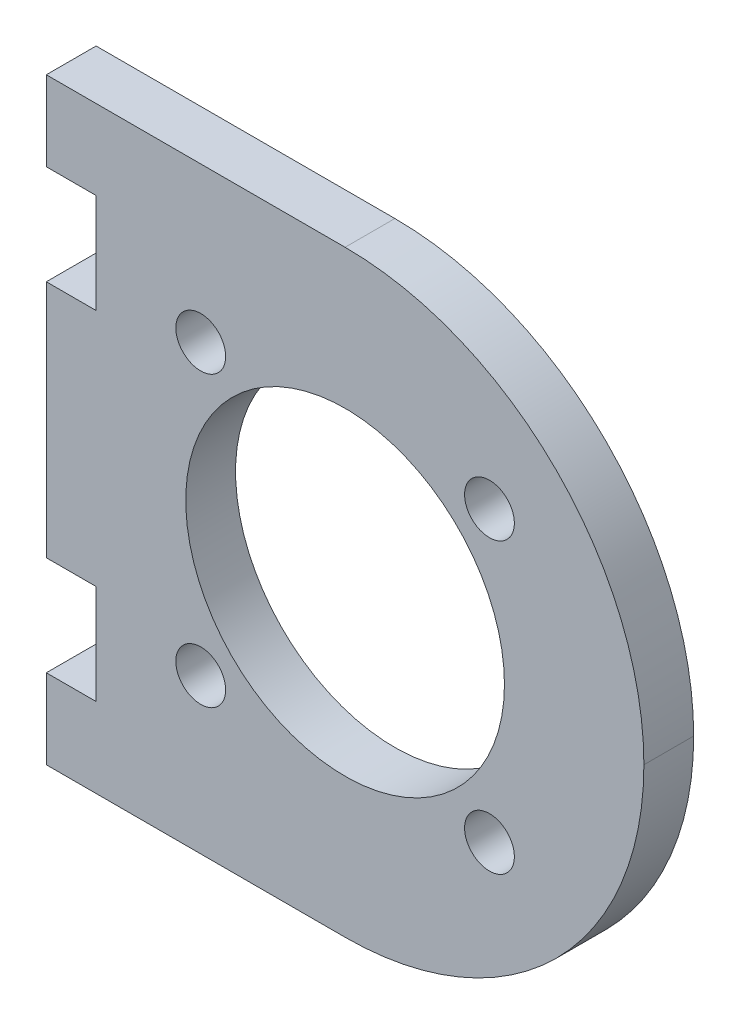
ISO-10303-21;
HEADER;
FILE_DESCRIPTION(('STEP AP214'),'2;1');
FILE_NAME('part.step','',(''),(''),'','','');
FILE_SCHEMA(('AUTOMOTIVE_DESIGN { 1 0 10303 214 1 1 1 1 }'));
ENDSEC;
DATA;
#1=APPLICATION_CONTEXT('core data for automotive mechanical design processes');
#2=APPLICATION_PROTOCOL_DEFINITION('international standard','automotive_design',2000,#1);
#3=PRODUCT_CONTEXT('',#1,'mechanical');
#4=PRODUCT('Part','Part','',(#3));
#5=PRODUCT_RELATED_PRODUCT_CATEGORY('part','',(#4));
#6=PRODUCT_DEFINITION_FORMATION('','',#4);
#7=PRODUCT_DEFINITION_CONTEXT('part definition',#1,'design');
#8=PRODUCT_DEFINITION('design','',#6,#7);
#9=PRODUCT_DEFINITION_SHAPE('','',#8);
#10=(LENGTH_UNIT() NAMED_UNIT(*) SI_UNIT(.MILLI.,.METRE.));
#11=(NAMED_UNIT(*) PLANE_ANGLE_UNIT() SI_UNIT($,.RADIAN.));
#12=(NAMED_UNIT(*) SI_UNIT($,.STERADIAN.) SOLID_ANGLE_UNIT());
#13=UNCERTAINTY_MEASURE_WITH_UNIT(LENGTH_MEASURE(1.E-05),#10,'distance_accuracy_value','');
#14=(GEOMETRIC_REPRESENTATION_CONTEXT(3) GLOBAL_UNCERTAINTY_ASSIGNED_CONTEXT((#13)) GLOBAL_UNIT_ASSIGNED_CONTEXT((#10,
#11,#12)) REPRESENTATION_CONTEXT('',''));
#15=CARTESIAN_POINT('',(0.,0.,0.));
#16=DIRECTION('',(0.,0.,1.));
#17=DIRECTION('',(1.,0.,0.));
#18=AXIS2_PLACEMENT_3D('',#15,#16,#17);
#19=CARTESIAN_POINT('',(0.,0.,5.));
#20=DIRECTION('',(0.,0.,1.));
#21=DIRECTION('',(1.,0.,0.));
#22=AXIS2_PLACEMENT_3D('',#19,#20,#21);
#23=PLANE('',#22);
#24=CARTESIAN_POINT('',(14.4956890143243,-14.4956890143243,5.));
#25=DIRECTION('',(0.,0.,1.));
#26=DIRECTION('',(1.,0.,0.));
#27=AXIS2_PLACEMENT_3D('',#24,#25,#26);
#28=CIRCLE('',#27,2.50000000000016);
#29=CARTESIAN_POINT('',(16.9956890143245,-14.4956890143243,5.));
#30=VERTEX_POINT('',#29);
#31=EDGE_CURVE('E199',#30,#30,#28,.T.);
#32=ORIENTED_EDGE('',*,*,#31,.F.);
#33=EDGE_LOOP('',(#32));
#34=FACE_BOUND('',#33,.T.);
#35=CARTESIAN_POINT('',(-14.4956890143242,14.4956890143242,5.));
#36=DIRECTION('',(0.,0.,1.));
#37=DIRECTION('',(1.,0.,0.));
#38=AXIS2_PLACEMENT_3D('',#35,#36,#37);
#39=CIRCLE('',#38,2.5);
#40=CARTESIAN_POINT('',(-11.9956890143242,14.4956890143242,5.));
#41=VERTEX_POINT('',#40);
#42=EDGE_CURVE('E211',#41,#41,#39,.T.);
#43=ORIENTED_EDGE('',*,*,#42,.F.);
#44=EDGE_LOOP('',(#43));
#45=FACE_BOUND('',#44,.T.);
#46=CARTESIAN_POINT('',(0.,0.,5.));
#47=DIRECTION('',(0.,0.,1.));
#48=DIRECTION('',(1.,0.,0.));
#49=AXIS2_PLACEMENT_3D('',#46,#47,#48);
#50=CIRCLE('',#49,30.);
#51=CARTESIAN_POINT('',(0.,-30.,5.));
#52=VERTEX_POINT('',#51);
#53=CARTESIAN_POINT('',(30.,0.,5.));
#54=VERTEX_POINT('',#53);
#55=EDGE_CURVE('E55',#52,#54,#50,.T.);
#56=ORIENTED_EDGE('',*,*,#55,.T.);
#57=CARTESIAN_POINT('',(0.,0.,5.));
#58=DIRECTION('',(0.,0.,1.));
#59=DIRECTION('',(1.,0.,0.));
#60=AXIS2_PLACEMENT_3D('',#57,#58,#59);
#61=CIRCLE('',#60,30.);
#62=CARTESIAN_POINT('',(0.,30.,5.));
#63=VERTEX_POINT('',#62);
#64=EDGE_CURVE('E48',#54,#63,#61,.T.);
#65=ORIENTED_EDGE('',*,*,#64,.T.);
#66=DIRECTION('',(-1.,0.,0.));
#67=VECTOR('',#66,1.);
#68=CARTESIAN_POINT('',(30.,30.,5.));
#69=LINE('',#68,#67);
#70=CARTESIAN_POINT('',(-30.,30.,5.));
#71=VERTEX_POINT('',#70);
#72=EDGE_CURVE('E150',#63,#71,#69,.T.);
#73=ORIENTED_EDGE('',*,*,#72,.T.);
#74=DIRECTION('',(0.,-1.,0.));
#75=VECTOR('',#74,1.);
#76=CARTESIAN_POINT('',(-30.,22.,5.));
#77=LINE('',#76,#75);
#78=CARTESIAN_POINT('',(-30.,22.,5.));
#79=VERTEX_POINT('',#78);
#80=EDGE_CURVE('E145',#71,#79,#77,.T.);
#81=ORIENTED_EDGE('',*,*,#80,.T.);
#82=DIRECTION('',(1.,0.,0.));
#83=VECTOR('',#82,1.);
#84=CARTESIAN_POINT('',(-25.,22.,5.));
#85=LINE('',#84,#83);
#86=CARTESIAN_POINT('',(-25.,22.,5.));
#87=VERTEX_POINT('',#86);
#88=EDGE_CURVE('E135',#79,#87,#85,.T.);
#89=ORIENTED_EDGE('',*,*,#88,.T.);
#90=DIRECTION('',(0.,-1.,0.));
#91=VECTOR('',#90,1.);
#92=CARTESIAN_POINT('',(-25.,12.,5.));
#93=LINE('',#92,#91);
#94=CARTESIAN_POINT('',(-25.,12.,5.));
#95=VERTEX_POINT('',#94);
#96=EDGE_CURVE('E144',#87,#95,#93,.T.);
#97=ORIENTED_EDGE('',*,*,#96,.T.);
#98=DIRECTION('',(-1.,0.,0.));
#99=VECTOR('',#98,1.);
#100=CARTESIAN_POINT('',(-30.,12.,5.));
#101=LINE('',#100,#99);
#102=CARTESIAN_POINT('',(-30.,12.,5.));
#103=VERTEX_POINT('',#102);
#104=EDGE_CURVE('E223',#95,#103,#101,.T.);
#105=ORIENTED_EDGE('',*,*,#104,.T.);
#106=DIRECTION('',(0.,-1.,0.));
#107=VECTOR('',#106,1.);
#108=CARTESIAN_POINT('',(-30.,-12.,5.));
#109=LINE('',#108,#107);
#110=CARTESIAN_POINT('',(-30.,-12.,5.));
#111=VERTEX_POINT('',#110);
#112=EDGE_CURVE('E225',#103,#111,#109,.T.);
#113=ORIENTED_EDGE('',*,*,#112,.T.);
#114=DIRECTION('',(1.,0.,0.));
#115=VECTOR('',#114,1.);
#116=CARTESIAN_POINT('',(-30.,-12.,5.));
#117=LINE('',#116,#115);
#118=CARTESIAN_POINT('',(-25.,-12.,5.));
#119=VERTEX_POINT('',#118);
#120=EDGE_CURVE('E227',#111,#119,#117,.T.);
#121=ORIENTED_EDGE('',*,*,#120,.T.);
#122=DIRECTION('',(0.,-1.,0.));
#123=VECTOR('',#122,1.);
#124=CARTESIAN_POINT('',(-25.,-12.,5.));
#125=LINE('',#124,#123);
#126=CARTESIAN_POINT('',(-25.,-22.,5.));
#127=VERTEX_POINT('',#126);
#128=EDGE_CURVE('E229',#119,#127,#125,.T.);
#129=ORIENTED_EDGE('',*,*,#128,.T.);
#130=DIRECTION('',(-1.,0.,0.));
#131=VECTOR('',#130,1.);
#132=CARTESIAN_POINT('',(-25.,-22.,5.));
#133=LINE('',#132,#131);
#134=CARTESIAN_POINT('',(-30.,-22.,5.));
#135=VERTEX_POINT('',#134);
#136=EDGE_CURVE('E231',#127,#135,#133,.T.);
#137=ORIENTED_EDGE('',*,*,#136,.T.);
#138=DIRECTION('',(0.,-1.,0.));
#139=VECTOR('',#138,1.);
#140=CARTESIAN_POINT('',(-30.,-30.,5.));
#141=LINE('',#140,#139);
#142=CARTESIAN_POINT('',(-30.,-30.,5.));
#143=VERTEX_POINT('',#142);
#144=EDGE_CURVE('E233',#135,#143,#141,.T.);
#145=ORIENTED_EDGE('',*,*,#144,.T.);
#146=DIRECTION('',(1.,0.,0.));
#147=VECTOR('',#146,1.);
#148=CARTESIAN_POINT('',(30.,-30.,5.));
#149=LINE('',#148,#147);
#150=EDGE_CURVE('E180',#143,#52,#149,.T.);
#151=ORIENTED_EDGE('',*,*,#150,.T.);
#152=EDGE_LOOP('',(#56,#65,#73,#81,#89,#97,#105,#113,#121,#129,#137,#145,#151));
#153=FACE_BOUND('',#152,.T.);
#154=CARTESIAN_POINT('',(0.,0.,5.));
#155=DIRECTION('',(0.,0.,1.));
#156=DIRECTION('',(1.,0.,0.));
#157=AXIS2_PLACEMENT_3D('',#154,#155,#156);
#158=CIRCLE('',#157,16.);
#159=CARTESIAN_POINT('',(16.,0.,5.));
#160=VERTEX_POINT('',#159);
#161=EDGE_CURVE('E217',#160,#160,#158,.T.);
#162=ORIENTED_EDGE('',*,*,#161,.F.);
#163=EDGE_LOOP('',(#162));
#164=FACE_BOUND('',#163,.T.);
#165=CARTESIAN_POINT('',(14.4956890143244,14.4956890143242,5.));
#166=DIRECTION('',(0.,0.,1.));
#167=DIRECTION('',(1.,0.,0.));
#168=AXIS2_PLACEMENT_3D('',#165,#166,#167);
#169=CIRCLE('',#168,2.50000000000001);
#170=CARTESIAN_POINT('',(16.9956890143244,14.4956890143242,5.));
#171=VERTEX_POINT('',#170);
#172=EDGE_CURVE('E205',#171,#171,#169,.T.);
#173=ORIENTED_EDGE('',*,*,#172,.F.);
#174=EDGE_LOOP('',(#173));
#175=FACE_BOUND('',#174,.T.);
#176=CARTESIAN_POINT('',(-14.4956890143244,-14.495689014324,5.));
#177=DIRECTION('',(0.,0.,1.));
#178=DIRECTION('',(1.,0.,0.));
#179=AXIS2_PLACEMENT_3D('',#176,#177,#178);
#180=CIRCLE('',#179,2.5);
#181=CARTESIAN_POINT('',(-11.9956890143244,-14.495689014324,5.));
#182=VERTEX_POINT('',#181);
#183=EDGE_CURVE('E191',#182,#182,#180,.T.);
#184=ORIENTED_EDGE('',*,*,#183,.F.);
#185=EDGE_LOOP('',(#184));
#186=FACE_BOUND('',#185,.T.);
#187=ADVANCED_FACE('F39',(#34,#45,#153,#164,#175,#186),#23,.T.);
#188=CARTESIAN_POINT('',(0.,0.,0.));
#189=DIRECTION('',(0.,0.,1.));
#190=DIRECTION('',(1.,0.,0.));
#191=AXIS2_PLACEMENT_3D('',#188,#189,#190);
#192=PLANE('',#191);
#193=DIRECTION('',(-1.,0.,0.));
#194=VECTOR('',#193,1.);
#195=CARTESIAN_POINT('',(30.,30.,0.));
#196=LINE('',#195,#194);
#197=CARTESIAN_POINT('',(0.,30.,0.));
#198=VERTEX_POINT('',#197);
#199=CARTESIAN_POINT('',(-30.,30.,0.));
#200=VERTEX_POINT('',#199);
#201=EDGE_CURVE('E154',#198,#200,#196,.T.);
#202=ORIENTED_EDGE('',*,*,#201,.F.);
#203=CARTESIAN_POINT('',(0.,0.,0.));
#204=DIRECTION('',(0.,0.,1.));
#205=DIRECTION('',(1.,0.,0.));
#206=AXIS2_PLACEMENT_3D('',#203,#204,#205);
#207=CIRCLE('',#206,30.);
#208=CARTESIAN_POINT('',(30.,0.,0.));
#209=VERTEX_POINT('',#208);
#210=EDGE_CURVE('E169',#198,#209,#207,.F.);
#211=ORIENTED_EDGE('',*,*,#210,.T.);
#212=CARTESIAN_POINT('',(0.,0.,0.));
#213=DIRECTION('',(0.,0.,1.));
#214=DIRECTION('',(1.,0.,0.));
#215=AXIS2_PLACEMENT_3D('',#212,#213,#214);
#216=CIRCLE('',#215,30.);
#217=CARTESIAN_POINT('',(0.,-30.,0.));
#218=VERTEX_POINT('',#217);
#219=EDGE_CURVE('E162',#209,#218,#216,.F.);
#220=ORIENTED_EDGE('',*,*,#219,.T.);
#221=DIRECTION('',(1.,0.,0.));
#222=VECTOR('',#221,1.);
#223=CARTESIAN_POINT('',(30.,-30.,0.));
#224=LINE('',#223,#222);
#225=CARTESIAN_POINT('',(-30.,-30.,0.));
#226=VERTEX_POINT('',#225);
#227=EDGE_CURVE('E253',#226,#218,#224,.T.);
#228=ORIENTED_EDGE('',*,*,#227,.F.);
#229=DIRECTION('',(0.,-1.,0.));
#230=VECTOR('',#229,1.);
#231=CARTESIAN_POINT('',(-30.,-30.,0.));
#232=LINE('',#231,#230);
#233=CARTESIAN_POINT('',(-30.,-22.,0.));
#234=VERTEX_POINT('',#233);
#235=EDGE_CURVE('E251',#234,#226,#232,.T.);
#236=ORIENTED_EDGE('',*,*,#235,.F.);
#237=DIRECTION('',(-1.,0.,0.));
#238=VECTOR('',#237,1.);
#239=CARTESIAN_POINT('',(-25.,-22.,0.));
#240=LINE('',#239,#238);
#241=CARTESIAN_POINT('',(-25.,-22.,0.));
#242=VERTEX_POINT('',#241);
#243=EDGE_CURVE('E249',#242,#234,#240,.T.);
#244=ORIENTED_EDGE('',*,*,#243,.F.);
#245=DIRECTION('',(0.,-1.,0.));
#246=VECTOR('',#245,1.);
#247=CARTESIAN_POINT('',(-25.,-12.,0.));
#248=LINE('',#247,#246);
#249=CARTESIAN_POINT('',(-25.,-12.,0.));
#250=VERTEX_POINT('',#249);
#251=EDGE_CURVE('E247',#250,#242,#248,.T.);
#252=ORIENTED_EDGE('',*,*,#251,.F.);
#253=DIRECTION('',(1.,0.,0.));
#254=VECTOR('',#253,1.);
#255=CARTESIAN_POINT('',(-30.,-12.,0.));
#256=LINE('',#255,#254);
#257=CARTESIAN_POINT('',(-30.,-12.,0.));
#258=VERTEX_POINT('',#257);
#259=EDGE_CURVE('E245',#258,#250,#256,.T.);
#260=ORIENTED_EDGE('',*,*,#259,.F.);
#261=DIRECTION('',(0.,-1.,0.));
#262=VECTOR('',#261,1.);
#263=CARTESIAN_POINT('',(-30.,-12.,0.));
#264=LINE('',#263,#262);
#265=CARTESIAN_POINT('',(-30.,12.,0.));
#266=VERTEX_POINT('',#265);
#267=EDGE_CURVE('E243',#266,#258,#264,.T.);
#268=ORIENTED_EDGE('',*,*,#267,.F.);
#269=DIRECTION('',(-1.,0.,0.));
#270=VECTOR('',#269,1.);
#271=CARTESIAN_POINT('',(-30.,12.,0.));
#272=LINE('',#271,#270);
#273=CARTESIAN_POINT('',(-25.,12.,0.));
#274=VERTEX_POINT('',#273);
#275=EDGE_CURVE('E241',#274,#266,#272,.T.);
#276=ORIENTED_EDGE('',*,*,#275,.F.);
#277=DIRECTION('',(0.,-1.,0.));
#278=VECTOR('',#277,1.);
#279=CARTESIAN_POINT('',(-25.,12.,0.));
#280=LINE('',#279,#278);
#281=CARTESIAN_POINT('',(-25.,22.,0.));
#282=VERTEX_POINT('',#281);
#283=EDGE_CURVE('E239',#282,#274,#280,.T.);
#284=ORIENTED_EDGE('',*,*,#283,.F.);
#285=DIRECTION('',(1.,0.,0.));
#286=VECTOR('',#285,1.);
#287=CARTESIAN_POINT('',(-25.,22.,0.));
#288=LINE('',#287,#286);
#289=CARTESIAN_POINT('',(-30.,22.,0.));
#290=VERTEX_POINT('',#289);
#291=EDGE_CURVE('E237',#290,#282,#288,.T.);
#292=ORIENTED_EDGE('',*,*,#291,.F.);
#293=DIRECTION('',(0.,-1.,0.));
#294=VECTOR('',#293,1.);
#295=CARTESIAN_POINT('',(-30.,22.,0.));
#296=LINE('',#295,#294);
#297=EDGE_CURVE('E158',#200,#290,#296,.T.);
#298=ORIENTED_EDGE('',*,*,#297,.F.);
#299=EDGE_LOOP('',(#202,#211,#220,#228,#236,#244,#252,#260,#268,#276,#284,#292,#298));
#300=FACE_BOUND('',#299,.T.);
#301=CARTESIAN_POINT('',(0.,0.,0.));
#302=DIRECTION('',(0.,0.,1.));
#303=DIRECTION('',(1.,0.,0.));
#304=AXIS2_PLACEMENT_3D('',#301,#302,#303);
#305=CIRCLE('',#304,16.);
#306=CARTESIAN_POINT('',(16.,0.,0.));
#307=VERTEX_POINT('',#306);
#308=EDGE_CURVE('E214',#307,#307,#305,.T.);
#309=ORIENTED_EDGE('',*,*,#308,.T.);
#310=EDGE_LOOP('',(#309));
#311=FACE_BOUND('',#310,.T.);
#312=CARTESIAN_POINT('',(-14.4956890143242,14.4956890143242,0.));
#313=DIRECTION('',(0.,0.,1.));
#314=DIRECTION('',(1.,0.,0.));
#315=AXIS2_PLACEMENT_3D('',#312,#313,#314);
#316=CIRCLE('',#315,2.5);
#317=CARTESIAN_POINT('',(-11.9956890143242,14.4956890143242,0.));
#318=VERTEX_POINT('',#317);
#319=EDGE_CURVE('E208',#318,#318,#316,.T.);
#320=ORIENTED_EDGE('',*,*,#319,.T.);
#321=EDGE_LOOP('',(#320));
#322=FACE_BOUND('',#321,.T.);
#323=CARTESIAN_POINT('',(14.4956890143244,14.4956890143242,0.));
#324=DIRECTION('',(0.,0.,1.));
#325=DIRECTION('',(1.,0.,0.));
#326=AXIS2_PLACEMENT_3D('',#323,#324,#325);
#327=CIRCLE('',#326,2.50000000000001);
#328=CARTESIAN_POINT('',(16.9956890143244,14.4956890143242,0.));
#329=VERTEX_POINT('',#328);
#330=EDGE_CURVE('E202',#329,#329,#327,.T.);
#331=ORIENTED_EDGE('',*,*,#330,.T.);
#332=EDGE_LOOP('',(#331));
#333=FACE_BOUND('',#332,.T.);
#334=CARTESIAN_POINT('',(14.4956890143243,-14.4956890143243,0.));
#335=DIRECTION('',(0.,0.,1.));
#336=DIRECTION('',(1.,0.,0.));
#337=AXIS2_PLACEMENT_3D('',#334,#335,#336);
#338=CIRCLE('',#337,2.50000000000016);
#339=CARTESIAN_POINT('',(16.9956890143245,-14.4956890143243,0.));
#340=VERTEX_POINT('',#339);
#341=EDGE_CURVE('E196',#340,#340,#338,.T.);
#342=ORIENTED_EDGE('',*,*,#341,.T.);
#343=EDGE_LOOP('',(#342));
#344=FACE_BOUND('',#343,.T.);
#345=CARTESIAN_POINT('',(-14.4956890143244,-14.495689014324,0.));
#346=DIRECTION('',(0.,0.,1.));
#347=DIRECTION('',(1.,0.,0.));
#348=AXIS2_PLACEMENT_3D('',#345,#346,#347);
#349=CIRCLE('',#348,2.5);
#350=CARTESIAN_POINT('',(-11.9956890143244,-14.495689014324,0.));
#351=VERTEX_POINT('',#350);
#352=EDGE_CURVE('E189',#351,#351,#349,.T.);
#353=ORIENTED_EDGE('',*,*,#352,.T.);
#354=EDGE_LOOP('',(#353));
#355=FACE_BOUND('',#354,.T.);
#356=ADVANCED_FACE('F185',(#300,#311,#322,#333,#344,#355),#192,.F.);
#357=CARTESIAN_POINT('',(-30.,22.,5.));
#358=DIRECTION('',(1.,0.,0.));
#359=DIRECTION('',(0.,0.,-1.));
#360=AXIS2_PLACEMENT_3D('',#357,#358,#359);
#361=PLANE('',#360);
#362=ORIENTED_EDGE('',*,*,#297,.T.);
#363=DIRECTION('',(0.,0.,-1.));
#364=VECTOR('',#363,1.);
#365=CARTESIAN_POINT('',(-30.,22.,5.));
#366=LINE('',#365,#364);
#367=EDGE_CURVE('E139',#79,#290,#366,.T.);
#368=ORIENTED_EDGE('',*,*,#367,.F.);
#369=ORIENTED_EDGE('',*,*,#80,.F.);
#370=DIRECTION('',(0.,0.,-1.));
#371=VECTOR('',#370,1.);
#372=CARTESIAN_POINT('',(-30.,30.,5.));
#373=LINE('',#372,#371);
#374=EDGE_CURVE('E179',#71,#200,#373,.T.);
#375=ORIENTED_EDGE('',*,*,#374,.T.);
#376=EDGE_LOOP('',(#362,#368,#369,#375));
#377=FACE_BOUND('',#376,.T.);
#378=ADVANCED_FACE('F156',(#377),#361,.F.);
#379=CARTESIAN_POINT('',(-25.,22.,5.));
#380=DIRECTION('',(0.,1.,0.));
#381=DIRECTION('',(-1.,0.,0.));
#382=AXIS2_PLACEMENT_3D('',#379,#380,#381);
#383=PLANE('',#382);
#384=ORIENTED_EDGE('',*,*,#291,.T.);
#385=DIRECTION('',(0.,0.,-1.));
#386=VECTOR('',#385,1.);
#387=CARTESIAN_POINT('',(-25.,22.,5.));
#388=LINE('',#387,#386);
#389=EDGE_CURVE('E142',#87,#282,#388,.T.);
#390=ORIENTED_EDGE('',*,*,#389,.F.);
#391=ORIENTED_EDGE('',*,*,#88,.F.);
#392=ORIENTED_EDGE('',*,*,#367,.T.);
#393=EDGE_LOOP('',(#384,#390,#391,#392));
#394=FACE_BOUND('',#393,.T.);
#395=ADVANCED_FACE('F137',(#394),#383,.F.);
#396=CARTESIAN_POINT('',(-25.,12.,5.));
#397=DIRECTION('',(1.,0.,0.));
#398=DIRECTION('',(0.,1.,0.));
#399=AXIS2_PLACEMENT_3D('',#396,#397,#398);
#400=PLANE('',#399);
#401=ORIENTED_EDGE('',*,*,#283,.T.);
#402=DIRECTION('',(0.,0.,-1.));
#403=VECTOR('',#402,1.);
#404=CARTESIAN_POINT('',(-25.,12.,5.));
#405=LINE('',#404,#403);
#406=EDGE_CURVE('E164',#95,#274,#405,.T.);
#407=ORIENTED_EDGE('',*,*,#406,.F.);
#408=ORIENTED_EDGE('',*,*,#96,.F.);
#409=ORIENTED_EDGE('',*,*,#389,.T.);
#410=EDGE_LOOP('',(#401,#407,#408,#409));
#411=FACE_BOUND('',#410,.T.);
#412=ADVANCED_FACE('F296',(#411),#400,.F.);
#413=CARTESIAN_POINT('',(-30.,12.,5.));
#414=DIRECTION('',(0.,-1.,0.));
#415=DIRECTION('',(1.,0.,0.));
#416=AXIS2_PLACEMENT_3D('',#413,#414,#415);
#417=PLANE('',#416);
#418=ORIENTED_EDGE('',*,*,#275,.T.);
#419=DIRECTION('',(0.,0.,-1.));
#420=VECTOR('',#419,1.);
#421=CARTESIAN_POINT('',(-30.,12.,5.));
#422=LINE('',#421,#420);
#423=EDGE_CURVE('E272',#103,#266,#422,.T.);
#424=ORIENTED_EDGE('',*,*,#423,.F.);
#425=ORIENTED_EDGE('',*,*,#104,.F.);
#426=ORIENTED_EDGE('',*,*,#406,.T.);
#427=EDGE_LOOP('',(#418,#424,#425,#426));
#428=FACE_BOUND('',#427,.T.);
#429=ADVANCED_FACE('F279',(#428),#417,.F.);
#430=CARTESIAN_POINT('',(-30.,-12.,5.));
#431=DIRECTION('',(1.,0.,0.));
#432=DIRECTION('',(0.,0.,-1.));
#433=AXIS2_PLACEMENT_3D('',#430,#431,#432);
#434=PLANE('',#433);
#435=ORIENTED_EDGE('',*,*,#267,.T.);
#436=DIRECTION('',(0.,0.,-1.));
#437=VECTOR('',#436,1.);
#438=CARTESIAN_POINT('',(-30.,-12.,5.));
#439=LINE('',#438,#437);
#440=EDGE_CURVE('E269',#111,#258,#439,.T.);
#441=ORIENTED_EDGE('',*,*,#440,.F.);
#442=ORIENTED_EDGE('',*,*,#112,.F.);
#443=ORIENTED_EDGE('',*,*,#423,.T.);
#444=EDGE_LOOP('',(#435,#441,#442,#443));
#445=FACE_BOUND('',#444,.T.);
#446=ADVANCED_FACE('F288',(#445),#434,.F.);
#447=CARTESIAN_POINT('',(-30.,-12.,5.));
#448=DIRECTION('',(0.,1.,0.));
#449=DIRECTION('',(-1.,0.,0.));
#450=AXIS2_PLACEMENT_3D('',#447,#448,#449);
#451=PLANE('',#450);
#452=ORIENTED_EDGE('',*,*,#259,.T.);
#453=DIRECTION('',(0.,0.,-1.));
#454=VECTOR('',#453,1.);
#455=CARTESIAN_POINT('',(-25.,-12.,5.));
#456=LINE('',#455,#454);
#457=EDGE_CURVE('E266',#119,#250,#456,.T.);
#458=ORIENTED_EDGE('',*,*,#457,.F.);
#459=ORIENTED_EDGE('',*,*,#120,.F.);
#460=ORIENTED_EDGE('',*,*,#440,.T.);
#461=EDGE_LOOP('',(#452,#458,#459,#460));
#462=FACE_BOUND('',#461,.T.);
#463=ADVANCED_FACE('F292',(#462),#451,.F.);
#464=CARTESIAN_POINT('',(-25.,-12.,5.));
#465=DIRECTION('',(1.,0.,0.));
#466=DIRECTION('',(0.,0.,-1.));
#467=AXIS2_PLACEMENT_3D('',#464,#465,#466);
#468=PLANE('',#467);
#469=ORIENTED_EDGE('',*,*,#251,.T.);
#470=DIRECTION('',(0.,0.,-1.));
#471=VECTOR('',#470,1.);
#472=CARTESIAN_POINT('',(-25.,-22.,5.));
#473=LINE('',#472,#471);
#474=EDGE_CURVE('E263',#127,#242,#473,.T.);
#475=ORIENTED_EDGE('',*,*,#474,.F.);
#476=ORIENTED_EDGE('',*,*,#128,.F.);
#477=ORIENTED_EDGE('',*,*,#457,.T.);
#478=EDGE_LOOP('',(#469,#475,#476,#477));
#479=FACE_BOUND('',#478,.T.);
#480=ADVANCED_FACE('F331',(#479),#468,.F.);
#481=CARTESIAN_POINT('',(-25.,-22.,5.));
#482=DIRECTION('',(0.,-1.,0.));
#483=DIRECTION('',(1.,0.,0.));
#484=AXIS2_PLACEMENT_3D('',#481,#482,#483);
#485=PLANE('',#484);
#486=ORIENTED_EDGE('',*,*,#243,.T.);
#487=DIRECTION('',(0.,0.,-1.));
#488=VECTOR('',#487,1.);
#489=CARTESIAN_POINT('',(-30.,-22.,5.));
#490=LINE('',#489,#488);
#491=EDGE_CURVE('E260',#135,#234,#490,.T.);
#492=ORIENTED_EDGE('',*,*,#491,.F.);
#493=ORIENTED_EDGE('',*,*,#136,.F.);
#494=ORIENTED_EDGE('',*,*,#474,.T.);
#495=EDGE_LOOP('',(#486,#492,#493,#494));
#496=FACE_BOUND('',#495,.T.);
#497=ADVANCED_FACE('F327',(#496),#485,.F.);
#498=CARTESIAN_POINT('',(-30.,-30.,5.));
#499=DIRECTION('',(1.,0.,0.));
#500=DIRECTION('',(0.,1.,0.));
#501=AXIS2_PLACEMENT_3D('',#498,#499,#500);
#502=PLANE('',#501);
#503=ORIENTED_EDGE('',*,*,#235,.T.);
#504=DIRECTION('',(0.,0.,-1.));
#505=VECTOR('',#504,1.);
#506=CARTESIAN_POINT('',(-30.,-30.,5.));
#507=LINE('',#506,#505);
#508=EDGE_CURVE('E257',#143,#226,#507,.T.);
#509=ORIENTED_EDGE('',*,*,#508,.F.);
#510=ORIENTED_EDGE('',*,*,#144,.F.);
#511=ORIENTED_EDGE('',*,*,#491,.T.);
#512=EDGE_LOOP('',(#503,#509,#510,#511));
#513=FACE_BOUND('',#512,.T.);
#514=ADVANCED_FACE('F324',(#513),#502,.F.);
#515=CARTESIAN_POINT('',(30.,-30.,5.));
#516=DIRECTION('',(0.,1.,0.));
#517=DIRECTION('',(0.,0.,1.));
#518=AXIS2_PLACEMENT_3D('',#515,#516,#517);
#519=PLANE('',#518);
#520=ORIENTED_EDGE('',*,*,#227,.T.);
#521=DIRECTION('',(0.,0.,-1.));
#522=VECTOR('',#521,1.);
#523=CARTESIAN_POINT('',(0.,-30.,5.));
#524=LINE('',#523,#522);
#525=EDGE_CURVE('E11',#218,#52,#524,.F.);
#526=ORIENTED_EDGE('',*,*,#525,.T.);
#527=ORIENTED_EDGE('',*,*,#150,.F.);
#528=ORIENTED_EDGE('',*,*,#508,.T.);
#529=EDGE_LOOP('',(#520,#526,#527,#528));
#530=FACE_BOUND('',#529,.T.);
#531=ADVANCED_FACE('F321',(#530),#519,.F.);
#532=CARTESIAN_POINT('',(30.,30.,5.));
#533=DIRECTION('',(0.,-1.,0.));
#534=DIRECTION('',(0.,0.,-1.));
#535=AXIS2_PLACEMENT_3D('',#532,#533,#534);
#536=PLANE('',#535);
#537=ORIENTED_EDGE('',*,*,#72,.F.);
#538=DIRECTION('',(0.,0.,-1.));
#539=VECTOR('',#538,1.);
#540=CARTESIAN_POINT('',(0.,30.,5.));
#541=LINE('',#540,#539);
#542=EDGE_CURVE('E159',#63,#198,#541,.T.);
#543=ORIENTED_EDGE('',*,*,#542,.T.);
#544=ORIENTED_EDGE('',*,*,#201,.T.);
#545=ORIENTED_EDGE('',*,*,#374,.F.);
#546=EDGE_LOOP('',(#537,#543,#544,#545));
#547=FACE_BOUND('',#546,.T.);
#548=ADVANCED_FACE('F177',(#547),#536,.F.);
#549=CARTESIAN_POINT('',(0.,0.,5.));
#550=DIRECTION('',(0.,0.,-1.));
#551=DIRECTION('',(-1.,0.,0.));
#552=AXIS2_PLACEMENT_3D('',#549,#550,#551);
#553=CYLINDRICAL_SURFACE('',#552,16.);
#554=ORIENTED_EDGE('',*,*,#161,.T.);
#555=EDGE_LOOP('',(#554));
#556=FACE_BOUND('',#555,.T.);
#557=ORIENTED_EDGE('',*,*,#308,.F.);
#558=EDGE_LOOP('',(#557));
#559=FACE_BOUND('',#558,.T.);
#560=ADVANCED_FACE('F316',(#556,#559),#553,.F.);
#561=CARTESIAN_POINT('',(-14.4956890143242,14.4956890143242,5.));
#562=DIRECTION('',(0.,0.,-1.));
#563=DIRECTION('',(-1.,0.,0.));
#564=AXIS2_PLACEMENT_3D('',#561,#562,#563);
#565=CYLINDRICAL_SURFACE('',#564,2.5);
#566=ORIENTED_EDGE('',*,*,#42,.T.);
#567=EDGE_LOOP('',(#566));
#568=FACE_BOUND('',#567,.T.);
#569=ORIENTED_EDGE('',*,*,#319,.F.);
#570=EDGE_LOOP('',(#569));
#571=FACE_BOUND('',#570,.T.);
#572=ADVANCED_FACE('F371',(#568,#571),#565,.F.);
#573=CARTESIAN_POINT('',(14.4956890143244,14.4956890143242,5.));
#574=DIRECTION('',(0.,0.,-1.));
#575=DIRECTION('',(-1.,0.,0.));
#576=AXIS2_PLACEMENT_3D('',#573,#574,#575);
#577=CYLINDRICAL_SURFACE('',#576,2.50000000000001);
#578=ORIENTED_EDGE('',*,*,#172,.T.);
#579=EDGE_LOOP('',(#578));
#580=FACE_BOUND('',#579,.T.);
#581=ORIENTED_EDGE('',*,*,#330,.F.);
#582=EDGE_LOOP('',(#581));
#583=FACE_BOUND('',#582,.T.);
#584=ADVANCED_FACE('F380',(#580,#583),#577,.F.);
#585=CARTESIAN_POINT('',(14.4956890143243,-14.4956890143243,5.));
#586=DIRECTION('',(0.,0.,-1.));
#587=DIRECTION('',(-1.,0.,0.));
#588=AXIS2_PLACEMENT_3D('',#585,#586,#587);
#589=CYLINDRICAL_SURFACE('',#588,2.50000000000016);
#590=ORIENTED_EDGE('',*,*,#31,.T.);
#591=EDGE_LOOP('',(#590));
#592=FACE_BOUND('',#591,.T.);
#593=ORIENTED_EDGE('',*,*,#341,.F.);
#594=EDGE_LOOP('',(#593));
#595=FACE_BOUND('',#594,.T.);
#596=ADVANCED_FACE('F388',(#592,#595),#589,.F.);
#597=CARTESIAN_POINT('',(-14.4956890143244,-14.495689014324,5.));
#598=DIRECTION('',(0.,0.,-1.));
#599=DIRECTION('',(-1.,0.,0.));
#600=AXIS2_PLACEMENT_3D('',#597,#598,#599);
#601=CYLINDRICAL_SURFACE('',#600,2.5);
#602=ORIENTED_EDGE('',*,*,#183,.T.);
#603=EDGE_LOOP('',(#602));
#604=FACE_BOUND('',#603,.T.);
#605=ORIENTED_EDGE('',*,*,#352,.F.);
#606=EDGE_LOOP('',(#605));
#607=FACE_BOUND('',#606,.T.);
#608=ADVANCED_FACE('F396',(#604,#607),#601,.F.);
#609=CARTESIAN_POINT('',(0.,0.,5.));
#610=DIRECTION('',(0.,0.,-1.));
#611=DIRECTION('',(-1.,0.,0.));
#612=AXIS2_PLACEMENT_3D('',#609,#610,#611);
#613=CYLINDRICAL_SURFACE('',#612,30.);
#614=DIRECTION('',(0.,0.,-1.));
#615=VECTOR('',#614,1.);
#616=CARTESIAN_POINT('',(30.,0.,5.));
#617=LINE('',#616,#615);
#618=EDGE_CURVE('E43',#54,#209,#617,.T.);
#619=ORIENTED_EDGE('',*,*,#618,.F.);
#620=ORIENTED_EDGE('',*,*,#55,.F.);
#621=ORIENTED_EDGE('',*,*,#525,.F.);
#622=ORIENTED_EDGE('',*,*,#219,.F.);
#623=EDGE_LOOP('',(#619,#620,#621,#622));
#624=FACE_BOUND('',#623,.T.);
#625=ADVANCED_FACE('F41',(#624),#613,.T.);
#626=CARTESIAN_POINT('',(0.,0.,5.));
#627=DIRECTION('',(0.,0.,-1.));
#628=DIRECTION('',(-1.,0.,0.));
#629=AXIS2_PLACEMENT_3D('',#626,#627,#628);
#630=CYLINDRICAL_SURFACE('',#629,30.);
#631=ORIENTED_EDGE('',*,*,#64,.F.);
#632=ORIENTED_EDGE('',*,*,#618,.T.);
#633=ORIENTED_EDGE('',*,*,#210,.F.);
#634=ORIENTED_EDGE('',*,*,#542,.F.);
#635=EDGE_LOOP('',(#631,#632,#633,#634));
#636=FACE_BOUND('',#635,.T.);
#637=ADVANCED_FACE('F182',(#636),#630,.T.);
#638=CLOSED_SHELL('',(#187,#356,#378,#395,#412,#429,#446,#463,#480,#497,#514,#531,#548,#560,
#572,#584,#596,#608,#625,#637));
#639=MANIFOLD_SOLID_BREP('B2',#638);
#640=ADVANCED_BREP_SHAPE_REPRESENTATION('',(#18,#639),#14);
#641=SHAPE_DEFINITION_REPRESENTATION(#9,#640);
ENDSEC;
END-ISO-10303-21;
